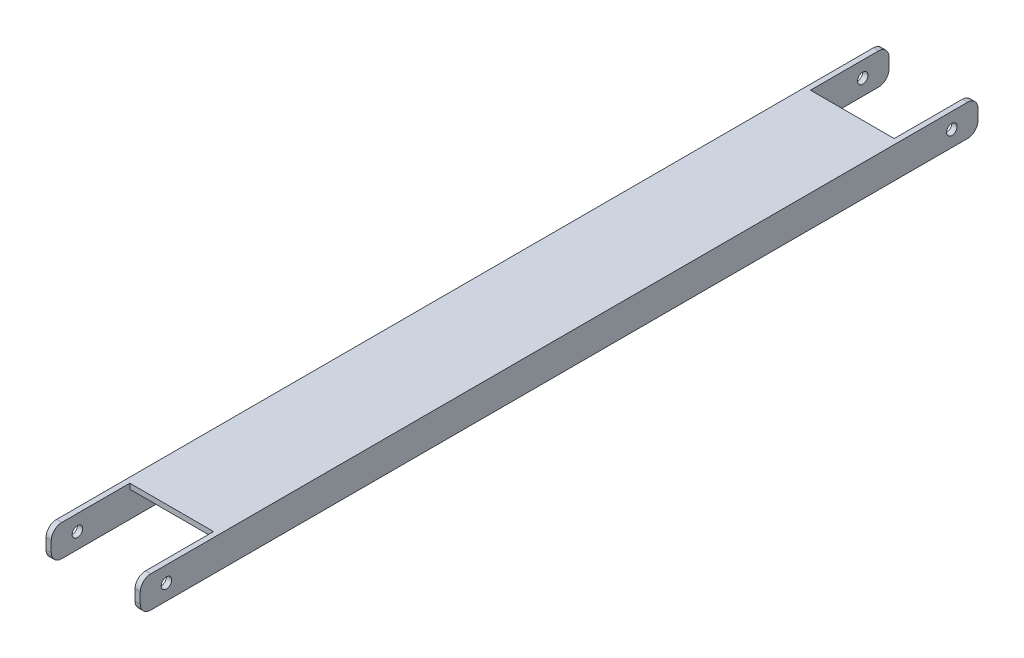
ISO-10303-21;
HEADER;
FILE_DESCRIPTION(('STEP AP214'),'2;1');
FILE_NAME('part.step','',(''),(''),'','','');
FILE_SCHEMA(('AUTOMOTIVE_DESIGN { 1 0 10303 214 1 1 1 1 }'));
ENDSEC;
DATA;
#1=APPLICATION_CONTEXT('core data for automotive mechanical design processes');
#2=APPLICATION_PROTOCOL_DEFINITION('international standard','automotive_design',2000,#1);
#3=PRODUCT_CONTEXT('',#1,'mechanical');
#4=PRODUCT('Part','Part','',(#3));
#5=PRODUCT_RELATED_PRODUCT_CATEGORY('part','',(#4));
#6=PRODUCT_DEFINITION_FORMATION('','',#4);
#7=PRODUCT_DEFINITION_CONTEXT('part definition',#1,'design');
#8=PRODUCT_DEFINITION('design','',#6,#7);
#9=PRODUCT_DEFINITION_SHAPE('','',#8);
#10=(LENGTH_UNIT() NAMED_UNIT(*) SI_UNIT(.MILLI.,.METRE.));
#11=(NAMED_UNIT(*) PLANE_ANGLE_UNIT() SI_UNIT($,.RADIAN.));
#12=(NAMED_UNIT(*) SI_UNIT($,.STERADIAN.) SOLID_ANGLE_UNIT());
#13=UNCERTAINTY_MEASURE_WITH_UNIT(LENGTH_MEASURE(1.E-05),#10,'distance_accuracy_value','');
#14=(GEOMETRIC_REPRESENTATION_CONTEXT(3) GLOBAL_UNCERTAINTY_ASSIGNED_CONTEXT((#13)) GLOBAL_UNIT_ASSIGNED_CONTEXT((#10,
#11,#12)) REPRESENTATION_CONTEXT('',''));
#15=CARTESIAN_POINT('',(0.,0.,0.));
#16=DIRECTION('',(0.,0.,1.));
#17=DIRECTION('',(1.,0.,0.));
#18=AXIS2_PLACEMENT_3D('',#15,#16,#17);
#19=CARTESIAN_POINT('',(0.,0.,160.));
#20=DIRECTION('',(0.,0.,1.));
#21=DIRECTION('',(1.,0.,0.));
#22=AXIS2_PLACEMENT_3D('',#19,#20,#21);
#23=PLANE('',#22);
#24=DIRECTION('',(0.,-1.,0.));
#25=VECTOR('',#24,1.);
#26=CARTESIAN_POINT('',(-9.,-3.,160.));
#27=LINE('',#26,#25);
#28=CARTESIAN_POINT('',(-9.,1.,160.));
#29=VERTEX_POINT('',#28);
#30=CARTESIAN_POINT('',(-9.,-1.,160.));
#31=VERTEX_POINT('',#30);
#32=EDGE_CURVE('E223',#29,#31,#27,.T.);
#33=ORIENTED_EDGE('',*,*,#32,.T.);
#34=DIRECTION('',(1.,0.,0.));
#35=VECTOR('',#34,1.);
#36=CARTESIAN_POINT('',(-8.,-1.,160.));
#37=LINE('',#36,#35);
#38=CARTESIAN_POINT('',(-8.,-1.,160.));
#39=VERTEX_POINT('',#38);
#40=EDGE_CURVE('E326',#31,#39,#37,.T.);
#41=ORIENTED_EDGE('',*,*,#40,.T.);
#42=DIRECTION('',(0.,1.,0.));
#43=VECTOR('',#42,1.);
#44=CARTESIAN_POINT('',(-8.,-3.,160.));
#45=LINE('',#44,#43);
#46=CARTESIAN_POINT('',(-8.,1.,160.));
#47=VERTEX_POINT('',#46);
#48=EDGE_CURVE('E227',#39,#47,#45,.T.);
#49=ORIENTED_EDGE('',*,*,#48,.T.);
#50=DIRECTION('',(-1.,0.,0.));
#51=VECTOR('',#50,1.);
#52=CARTESIAN_POINT('',(-9.,1.,160.));
#53=LINE('',#52,#51);
#54=EDGE_CURVE('E323',#47,#29,#53,.T.);
#55=ORIENTED_EDGE('',*,*,#54,.T.);
#56=EDGE_LOOP('',(#33,#41,#49,#55));
#57=FACE_BOUND('',#56,.T.);
#58=ADVANCED_FACE('F40',(#57),#23,.T.);
#59=CARTESIAN_POINT('',(0.,0.,0.));
#60=DIRECTION('',(0.,0.,1.));
#61=DIRECTION('',(1.,0.,0.));
#62=AXIS2_PLACEMENT_3D('',#59,#60,#61);
#63=PLANE('',#62);
#64=DIRECTION('',(0.,-1.,0.));
#65=VECTOR('',#64,1.);
#66=CARTESIAN_POINT('',(-9.,-3.,0.));
#67=LINE('',#66,#65);
#68=CARTESIAN_POINT('',(-9.,1.,0.));
#69=VERTEX_POINT('',#68);
#70=CARTESIAN_POINT('',(-9.,-1.,0.));
#71=VERTEX_POINT('',#70);
#72=EDGE_CURVE('E221',#69,#71,#67,.T.);
#73=ORIENTED_EDGE('',*,*,#72,.F.);
#74=DIRECTION('',(-1.,0.,0.));
#75=VECTOR('',#74,1.);
#76=CARTESIAN_POINT('',(0.,1.,0.));
#77=LINE('',#76,#75);
#78=CARTESIAN_POINT('',(-8.,1.,0.));
#79=VERTEX_POINT('',#78);
#80=EDGE_CURVE('E313',#69,#79,#77,.F.);
#81=ORIENTED_EDGE('',*,*,#80,.T.);
#82=DIRECTION('',(0.,1.,0.));
#83=VECTOR('',#82,1.);
#84=CARTESIAN_POINT('',(-8.,-3.,0.));
#85=LINE('',#84,#83);
#86=CARTESIAN_POINT('',(-8.,-1.,0.));
#87=VERTEX_POINT('',#86);
#88=EDGE_CURVE('E243',#87,#79,#85,.T.);
#89=ORIENTED_EDGE('',*,*,#88,.F.);
#90=DIRECTION('',(1.,0.,0.));
#91=VECTOR('',#90,1.);
#92=CARTESIAN_POINT('',(0.,-1.,0.));
#93=LINE('',#92,#91);
#94=EDGE_CURVE('E310',#87,#71,#93,.F.);
#95=ORIENTED_EDGE('',*,*,#94,.T.);
#96=EDGE_LOOP('',(#73,#81,#89,#95));
#97=FACE_BOUND('',#96,.T.);
#98=ADVANCED_FACE('F372',(#97),#63,.F.);
#99=CARTESIAN_POINT('',(-9.,-3.,160.));
#100=DIRECTION('',(1.,0.,0.));
#101=DIRECTION('',(0.,0.,-1.));
#102=AXIS2_PLACEMENT_3D('',#99,#100,#101);
#103=PLANE('',#102);
#104=CARTESIAN_POINT('',(-9.,0.,155.));
#105=DIRECTION('',(1.,0.,0.));
#106=DIRECTION('',(0.,0.,-1.));
#107=AXIS2_PLACEMENT_3D('',#104,#105,#106);
#108=CIRCLE('',#107,0.999999999999998);
#109=CARTESIAN_POINT('',(-9.,0.,154.));
#110=VERTEX_POINT('',#109);
#111=EDGE_CURVE('E566',#110,#110,#108,.T.);
#112=ORIENTED_EDGE('',*,*,#111,.T.);
#113=EDGE_LOOP('',(#112));
#114=FACE_BOUND('',#113,.T.);
#115=CARTESIAN_POINT('',(-9.,0.,5.));
#116=DIRECTION('',(1.,0.,0.));
#117=DIRECTION('',(0.,0.,-1.));
#118=AXIS2_PLACEMENT_3D('',#115,#116,#117);
#119=CIRCLE('',#118,1.);
#120=CARTESIAN_POINT('',(-9.,0.,4.));
#121=VERTEX_POINT('',#120);
#122=EDGE_CURVE('E574',#121,#121,#119,.T.);
#123=ORIENTED_EDGE('',*,*,#122,.T.);
#124=EDGE_LOOP('',(#123));
#125=FACE_BOUND('',#124,.T.);
#126=DIRECTION('',(0.,0.,-1.));
#127=VECTOR('',#126,1.);
#128=CARTESIAN_POINT('',(-9.,3.,160.));
#129=LINE('',#128,#127);
#130=CARTESIAN_POINT('',(-9.,3.,158.));
#131=VERTEX_POINT('',#130);
#132=CARTESIAN_POINT('',(-9.,3.,2.));
#133=VERTEX_POINT('',#132);
#134=EDGE_CURVE('E236',#131,#133,#129,.T.);
#135=ORIENTED_EDGE('',*,*,#134,.T.);
#136=CARTESIAN_POINT('',(-9.,1.,2.));
#137=DIRECTION('',(1.,0.,0.));
#138=DIRECTION('',(0.,0.,-1.));
#139=AXIS2_PLACEMENT_3D('',#136,#137,#138);
#140=CIRCLE('',#139,2.);
#141=EDGE_CURVE('E307',#133,#69,#140,.F.);
#142=ORIENTED_EDGE('',*,*,#141,.T.);
#143=ORIENTED_EDGE('',*,*,#72,.T.);
#144=CARTESIAN_POINT('',(-9.,-1.,2.));
#145=DIRECTION('',(1.,0.,0.));
#146=DIRECTION('',(0.,0.,-1.));
#147=AXIS2_PLACEMENT_3D('',#144,#145,#146);
#148=CIRCLE('',#147,2.);
#149=CARTESIAN_POINT('',(-9.,-3.,2.));
#150=VERTEX_POINT('',#149);
#151=EDGE_CURVE('E303',#71,#150,#148,.F.);
#152=ORIENTED_EDGE('',*,*,#151,.T.);
#153=DIRECTION('',(0.,0.,-1.));
#154=VECTOR('',#153,1.);
#155=CARTESIAN_POINT('',(-9.,-3.,160.));
#156=LINE('',#155,#154);
#157=CARTESIAN_POINT('',(-9.,-3.,158.));
#158=VERTEX_POINT('',#157);
#159=EDGE_CURVE('E262',#158,#150,#156,.T.);
#160=ORIENTED_EDGE('',*,*,#159,.F.);
#161=CARTESIAN_POINT('',(-9.,-1.,158.));
#162=DIRECTION('',(1.,0.,0.));
#163=DIRECTION('',(0.,0.,-1.));
#164=AXIS2_PLACEMENT_3D('',#161,#162,#163);
#165=CIRCLE('',#164,2.);
#166=EDGE_CURVE('E305',#158,#31,#165,.F.);
#167=ORIENTED_EDGE('',*,*,#166,.T.);
#168=ORIENTED_EDGE('',*,*,#32,.F.);
#169=CARTESIAN_POINT('',(-9.,1.,158.));
#170=DIRECTION('',(1.,0.,0.));
#171=DIRECTION('',(0.,0.,-1.));
#172=AXIS2_PLACEMENT_3D('',#169,#170,#171);
#173=CIRCLE('',#172,2.);
#174=EDGE_CURVE('E302',#29,#131,#173,.F.);
#175=ORIENTED_EDGE('',*,*,#174,.T.);
#176=EDGE_LOOP('',(#135,#142,#143,#152,#160,#167,#168,#175));
#177=FACE_BOUND('',#176,.T.);
#178=ADVANCED_FACE('F381',(#114,#125,#177),#103,.F.);
#179=CARTESIAN_POINT('',(-9.,-3.,160.));
#180=DIRECTION('',(0.,1.,0.));
#181=DIRECTION('',(0.,0.,1.));
#182=AXIS2_PLACEMENT_3D('',#179,#180,#181);
#183=PLANE('',#182);
#184=ORIENTED_EDGE('',*,*,#159,.T.);
#185=DIRECTION('',(1.,0.,0.));
#186=VECTOR('',#185,1.);
#187=CARTESIAN_POINT('',(-9.,-3.,2.));
#188=LINE('',#187,#186);
#189=CARTESIAN_POINT('',(-8.,-3.,2.));
#190=VERTEX_POINT('',#189);
#191=EDGE_CURVE('E321',#150,#190,#188,.T.);
#192=ORIENTED_EDGE('',*,*,#191,.T.);
#193=DIRECTION('',(0.,0.,-1.));
#194=VECTOR('',#193,1.);
#195=CARTESIAN_POINT('',(-8.,-3.,160.));
#196=LINE('',#195,#194);
#197=CARTESIAN_POINT('',(-8.,-3.,158.));
#198=VERTEX_POINT('',#197);
#199=EDGE_CURVE('E265',#198,#190,#196,.T.);
#200=ORIENTED_EDGE('',*,*,#199,.F.);
#201=DIRECTION('',(1.,0.,0.));
#202=VECTOR('',#201,1.);
#203=CARTESIAN_POINT('',(-9.,-3.,158.));
#204=LINE('',#203,#202);
#205=EDGE_CURVE('E317',#198,#158,#204,.F.);
#206=ORIENTED_EDGE('',*,*,#205,.T.);
#207=EDGE_LOOP('',(#184,#192,#200,#206));
#208=FACE_BOUND('',#207,.T.);
#209=ADVANCED_FACE('F426',(#208),#183,.F.);
#210=CARTESIAN_POINT('',(-8.,-3.,160.));
#211=DIRECTION('',(-1.,0.,0.));
#212=DIRECTION('',(0.,0.,1.));
#213=AXIS2_PLACEMENT_3D('',#210,#211,#212);
#214=PLANE('',#213);
#215=CARTESIAN_POINT('',(-8.,0.,155.));
#216=DIRECTION('',(-1.,0.,0.));
#217=DIRECTION('',(0.,0.,1.));
#218=AXIS2_PLACEMENT_3D('',#215,#216,#217);
#219=CIRCLE('',#218,0.999999999999998);
#220=CARTESIAN_POINT('',(-8.,0.,156.));
#221=VERTEX_POINT('',#220);
#222=EDGE_CURVE('E187',#221,#221,#219,.T.);
#223=ORIENTED_EDGE('',*,*,#222,.T.);
#224=EDGE_LOOP('',(#223));
#225=FACE_BOUND('',#224,.T.);
#226=CARTESIAN_POINT('',(-8.,0.,5.));
#227=DIRECTION('',(-1.,0.,0.));
#228=DIRECTION('',(0.,0.,1.));
#229=AXIS2_PLACEMENT_3D('',#226,#227,#228);
#230=CIRCLE('',#229,1.);
#231=CARTESIAN_POINT('',(-8.,0.,6.));
#232=VERTEX_POINT('',#231);
#233=EDGE_CURVE('E560',#232,#232,#230,.T.);
#234=ORIENTED_EDGE('',*,*,#233,.T.);
#235=EDGE_LOOP('',(#234));
#236=FACE_BOUND('',#235,.T.);
#237=ORIENTED_EDGE('',*,*,#88,.T.);
#238=CARTESIAN_POINT('',(-8.,1.,2.));
#239=DIRECTION('',(-1.,0.,0.));
#240=DIRECTION('',(0.,0.,1.));
#241=AXIS2_PLACEMENT_3D('',#238,#239,#240);
#242=CIRCLE('',#241,2.);
#243=CARTESIAN_POINT('',(-8.,3.,2.));
#244=VERTEX_POINT('',#243);
#245=EDGE_CURVE('E320',#79,#244,#242,.F.);
#246=ORIENTED_EDGE('',*,*,#245,.T.);
#247=DIRECTION('',(0.,0.,1.));
#248=VECTOR('',#247,1.);
#249=CARTESIAN_POINT('',(-8.,3.,0.));
#250=LINE('',#249,#248);
#251=CARTESIAN_POINT('',(-8.,3.,15.));
#252=VERTEX_POINT('',#251);
#253=EDGE_CURVE('E208',#244,#252,#250,.T.);
#254=ORIENTED_EDGE('',*,*,#253,.T.);
#255=DIRECTION('',(0.,1.,0.));
#256=VECTOR('',#255,1.);
#257=CARTESIAN_POINT('',(-7.99999999999999,-3.,15.));
#258=LINE('',#257,#256);
#259=CARTESIAN_POINT('',(-7.99999999999999,2.,15.));
#260=VERTEX_POINT('',#259);
#261=EDGE_CURVE('E216',#260,#252,#258,.T.);
#262=ORIENTED_EDGE('',*,*,#261,.F.);
#263=DIRECTION('',(0.,0.,-1.));
#264=VECTOR('',#263,1.);
#265=CARTESIAN_POINT('',(-8.,2.,160.));
#266=LINE('',#265,#264);
#267=CARTESIAN_POINT('',(-7.99999999999999,2.,145.));
#268=VERTEX_POINT('',#267);
#269=EDGE_CURVE('E257',#268,#260,#266,.T.);
#270=ORIENTED_EDGE('',*,*,#269,.F.);
#271=DIRECTION('',(0.,1.,0.));
#272=VECTOR('',#271,1.);
#273=CARTESIAN_POINT('',(-7.99999999999999,-3.,145.));
#274=LINE('',#273,#272);
#275=CARTESIAN_POINT('',(-8.,3.,145.));
#276=VERTEX_POINT('',#275);
#277=EDGE_CURVE('E198',#268,#276,#274,.T.);
#278=ORIENTED_EDGE('',*,*,#277,.T.);
#279=DIRECTION('',(0.,0.,1.));
#280=VECTOR('',#279,1.);
#281=CARTESIAN_POINT('',(-8.,3.,160.));
#282=LINE('',#281,#280);
#283=CARTESIAN_POINT('',(-8.,3.,158.));
#284=VERTEX_POINT('',#283);
#285=EDGE_CURVE('E197',#276,#284,#282,.T.);
#286=ORIENTED_EDGE('',*,*,#285,.T.);
#287=CARTESIAN_POINT('',(-8.,1.,158.));
#288=DIRECTION('',(-1.,0.,0.));
#289=DIRECTION('',(0.,0.,1.));
#290=AXIS2_PLACEMENT_3D('',#287,#288,#289);
#291=CIRCLE('',#290,2.);
#292=EDGE_CURVE('E311',#284,#47,#291,.F.);
#293=ORIENTED_EDGE('',*,*,#292,.T.);
#294=ORIENTED_EDGE('',*,*,#48,.F.);
#295=CARTESIAN_POINT('',(-8.,-1.,158.));
#296=DIRECTION('',(-1.,0.,0.));
#297=DIRECTION('',(0.,0.,1.));
#298=AXIS2_PLACEMENT_3D('',#295,#296,#297);
#299=CIRCLE('',#298,2.);
#300=EDGE_CURVE('E58',#39,#198,#299,.F.);
#301=ORIENTED_EDGE('',*,*,#300,.T.);
#302=ORIENTED_EDGE('',*,*,#199,.T.);
#303=CARTESIAN_POINT('',(-8.,-1.,2.));
#304=DIRECTION('',(-1.,0.,0.));
#305=DIRECTION('',(0.,0.,1.));
#306=AXIS2_PLACEMENT_3D('',#303,#304,#305);
#307=CIRCLE('',#306,2.);
#308=EDGE_CURVE('E55',#190,#87,#307,.F.);
#309=ORIENTED_EDGE('',*,*,#308,.T.);
#310=EDGE_LOOP('',(#237,#246,#254,#262,#270,#278,#286,#293,#294,#301,#302,#309));
#311=FACE_BOUND('',#310,.T.);
#312=ADVANCED_FACE('F418',(#225,#236,#311),#214,.F.);
#313=CARTESIAN_POINT('',(8.,2.,160.));
#314=DIRECTION('',(0.,1.,0.));
#315=DIRECTION('',(0.,0.,1.));
#316=AXIS2_PLACEMENT_3D('',#313,#314,#315);
#317=PLANE('',#316);
#318=DIRECTION('',(0.,0.,-1.));
#319=VECTOR('',#318,1.);
#320=CARTESIAN_POINT('',(8.,2.,160.));
#321=LINE('',#320,#319);
#322=CARTESIAN_POINT('',(8.,2.,145.));
#323=VERTEX_POINT('',#322);
#324=CARTESIAN_POINT('',(8.,2.,15.));
#325=VERTEX_POINT('',#324);
#326=EDGE_CURVE('E256',#323,#325,#321,.T.);
#327=ORIENTED_EDGE('',*,*,#326,.F.);
#328=DIRECTION('',(-1.,0.,0.));
#329=VECTOR('',#328,1.);
#330=CARTESIAN_POINT('',(8.,2.,145.));
#331=LINE('',#330,#329);
#332=EDGE_CURVE('E193',#323,#268,#331,.T.);
#333=ORIENTED_EDGE('',*,*,#332,.T.);
#334=ORIENTED_EDGE('',*,*,#269,.T.);
#335=DIRECTION('',(1.,0.,0.));
#336=VECTOR('',#335,1.);
#337=CARTESIAN_POINT('',(8.,2.,15.));
#338=LINE('',#337,#336);
#339=EDGE_CURVE('E218',#260,#325,#338,.T.);
#340=ORIENTED_EDGE('',*,*,#339,.T.);
#341=EDGE_LOOP('',(#327,#333,#334,#340));
#342=FACE_BOUND('',#341,.T.);
#343=ADVANCED_FACE('F367',(#342),#317,.F.);
#344=CARTESIAN_POINT('',(8.,-3.,160.));
#345=DIRECTION('',(1.,0.,0.));
#346=DIRECTION('',(0.,0.,-1.));
#347=AXIS2_PLACEMENT_3D('',#344,#345,#346);
#348=PLANE('',#347);
#349=CARTESIAN_POINT('',(8.,0.,155.));
#350=DIRECTION('',(1.,0.,0.));
#351=DIRECTION('',(0.,0.,-1.));
#352=AXIS2_PLACEMENT_3D('',#349,#350,#351);
#353=CIRCLE('',#352,0.999999999999998);
#354=CARTESIAN_POINT('',(8.,0.,154.));
#355=VERTEX_POINT('',#354);
#356=EDGE_CURVE('E557',#355,#355,#353,.T.);
#357=ORIENTED_EDGE('',*,*,#356,.T.);
#358=EDGE_LOOP('',(#357));
#359=FACE_BOUND('',#358,.T.);
#360=CARTESIAN_POINT('',(8.,0.,5.));
#361=DIRECTION('',(1.,0.,0.));
#362=DIRECTION('',(0.,0.,-1.));
#363=AXIS2_PLACEMENT_3D('',#360,#361,#362);
#364=CIRCLE('',#363,1.);
#365=CARTESIAN_POINT('',(8.,0.,4.));
#366=VERTEX_POINT('',#365);
#367=EDGE_CURVE('E565',#366,#366,#364,.T.);
#368=ORIENTED_EDGE('',*,*,#367,.T.);
#369=EDGE_LOOP('',(#368));
#370=FACE_BOUND('',#369,.T.);
#371=DIRECTION('',(0.,-1.,0.));
#372=VECTOR('',#371,1.);
#373=CARTESIAN_POINT('',(8.,-3.,0.));
#374=LINE('',#373,#372);
#375=CARTESIAN_POINT('',(8.,1.,0.));
#376=VERTEX_POINT('',#375);
#377=CARTESIAN_POINT('',(8.,-0.999999999999998,0.));
#378=VERTEX_POINT('',#377);
#379=EDGE_CURVE('E245',#376,#378,#374,.T.);
#380=ORIENTED_EDGE('',*,*,#379,.T.);
#381=CARTESIAN_POINT('',(8.,-0.999999999999998,2.));
#382=DIRECTION('',(1.,0.,0.));
#383=DIRECTION('',(0.,0.,-1.));
#384=AXIS2_PLACEMENT_3D('',#381,#382,#383);
#385=CIRCLE('',#384,2.);
#386=CARTESIAN_POINT('',(8.,-3.,2.));
#387=VERTEX_POINT('',#386);
#388=EDGE_CURVE('E286',#378,#387,#385,.F.);
#389=ORIENTED_EDGE('',*,*,#388,.T.);
#390=DIRECTION('',(0.,0.,-1.));
#391=VECTOR('',#390,1.);
#392=CARTESIAN_POINT('',(8.,-3.,160.));
#393=LINE('',#392,#391);
#394=CARTESIAN_POINT('',(8.,-3.,158.));
#395=VERTEX_POINT('',#394);
#396=EDGE_CURVE('E254',#395,#387,#393,.T.);
#397=ORIENTED_EDGE('',*,*,#396,.F.);
#398=CARTESIAN_POINT('',(8.,-0.999999999999998,158.));
#399=DIRECTION('',(1.,0.,0.));
#400=DIRECTION('',(0.,0.,-1.));
#401=AXIS2_PLACEMENT_3D('',#398,#399,#400);
#402=CIRCLE('',#401,2.);
#403=CARTESIAN_POINT('',(8.,-0.999999999999998,160.));
#404=VERTEX_POINT('',#403);
#405=EDGE_CURVE('E281',#395,#404,#402,.F.);
#406=ORIENTED_EDGE('',*,*,#405,.T.);
#407=DIRECTION('',(0.,-1.,0.));
#408=VECTOR('',#407,1.);
#409=CARTESIAN_POINT('',(8.,-3.,160.));
#410=LINE('',#409,#408);
#411=CARTESIAN_POINT('',(8.,1.,160.));
#412=VERTEX_POINT('',#411);
#413=EDGE_CURVE('E234',#412,#404,#410,.T.);
#414=ORIENTED_EDGE('',*,*,#413,.F.);
#415=CARTESIAN_POINT('',(8.,1.,158.));
#416=DIRECTION('',(1.,0.,0.));
#417=DIRECTION('',(0.,0.,-1.));
#418=AXIS2_PLACEMENT_3D('',#415,#416,#417);
#419=CIRCLE('',#418,2.);
#420=CARTESIAN_POINT('',(8.,3.,158.));
#421=VERTEX_POINT('',#420);
#422=EDGE_CURVE('E181',#412,#421,#419,.F.);
#423=ORIENTED_EDGE('',*,*,#422,.T.);
#424=DIRECTION('',(0.,0.,-1.));
#425=VECTOR('',#424,1.);
#426=CARTESIAN_POINT('',(8.,3.,145.));
#427=LINE('',#426,#425);
#428=CARTESIAN_POINT('',(8.,3.,145.));
#429=VERTEX_POINT('',#428);
#430=EDGE_CURVE('E177',#421,#429,#427,.T.);
#431=ORIENTED_EDGE('',*,*,#430,.T.);
#432=DIRECTION('',(0.,1.,0.));
#433=VECTOR('',#432,1.);
#434=CARTESIAN_POINT('',(8.,-3.,145.));
#435=LINE('',#434,#433);
#436=EDGE_CURVE('E178',#323,#429,#435,.T.);
#437=ORIENTED_EDGE('',*,*,#436,.F.);
#438=ORIENTED_EDGE('',*,*,#326,.T.);
#439=DIRECTION('',(0.,1.,0.));
#440=VECTOR('',#439,1.);
#441=CARTESIAN_POINT('',(8.,-3.,15.));
#442=LINE('',#441,#440);
#443=CARTESIAN_POINT('',(8.,3.,15.));
#444=VERTEX_POINT('',#443);
#445=EDGE_CURVE('E220',#325,#444,#442,.T.);
#446=ORIENTED_EDGE('',*,*,#445,.T.);
#447=DIRECTION('',(0.,0.,-1.));
#448=VECTOR('',#447,1.);
#449=CARTESIAN_POINT('',(8.,3.,15.));
#450=LINE('',#449,#448);
#451=CARTESIAN_POINT('',(8.,3.,2.00000000000001));
#452=VERTEX_POINT('',#451);
#453=EDGE_CURVE('E213',#444,#452,#450,.T.);
#454=ORIENTED_EDGE('',*,*,#453,.T.);
#455=CARTESIAN_POINT('',(8.,1.,2.));
#456=DIRECTION('',(1.,0.,0.));
#457=DIRECTION('',(0.,0.,-1.));
#458=AXIS2_PLACEMENT_3D('',#455,#456,#457);
#459=CIRCLE('',#458,2.);
#460=EDGE_CURVE('E289',#452,#376,#459,.F.);
#461=ORIENTED_EDGE('',*,*,#460,.T.);
#462=EDGE_LOOP('',(#380,#389,#397,#406,#414,#423,#431,#437,#438,#446,#454,#461));
#463=FACE_BOUND('',#462,.T.);
#464=ADVANCED_FACE('F176',(#359,#370,#463),#348,.F.);
#465=CARTESIAN_POINT('',(8.,-3.,160.));
#466=DIRECTION('',(0.,1.,0.));
#467=DIRECTION('',(0.,0.,1.));
#468=AXIS2_PLACEMENT_3D('',#465,#466,#467);
#469=PLANE('',#468);
#470=ORIENTED_EDGE('',*,*,#396,.T.);
#471=DIRECTION('',(1.,0.,0.));
#472=VECTOR('',#471,1.);
#473=CARTESIAN_POINT('',(8.,-3.,2.));
#474=LINE('',#473,#472);
#475=CARTESIAN_POINT('',(9.,-3.,2.));
#476=VERTEX_POINT('',#475);
#477=EDGE_CURVE('E267',#387,#476,#474,.T.);
#478=ORIENTED_EDGE('',*,*,#477,.T.);
#479=DIRECTION('',(0.,0.,-1.));
#480=VECTOR('',#479,1.);
#481=CARTESIAN_POINT('',(9.,-3.,160.));
#482=LINE('',#481,#480);
#483=CARTESIAN_POINT('',(9.,-3.,158.));
#484=VERTEX_POINT('',#483);
#485=EDGE_CURVE('E252',#484,#476,#482,.T.);
#486=ORIENTED_EDGE('',*,*,#485,.F.);
#487=DIRECTION('',(1.,0.,0.));
#488=VECTOR('',#487,1.);
#489=CARTESIAN_POINT('',(8.,-3.,158.));
#490=LINE('',#489,#488);
#491=EDGE_CURVE('E270',#484,#395,#490,.F.);
#492=ORIENTED_EDGE('',*,*,#491,.T.);
#493=EDGE_LOOP('',(#470,#478,#486,#492));
#494=FACE_BOUND('',#493,.T.);
#495=ADVANCED_FACE('F363',(#494),#469,.F.);
#496=CARTESIAN_POINT('',(9.,-3.,160.));
#497=DIRECTION('',(-1.,0.,0.));
#498=DIRECTION('',(0.,0.,1.));
#499=AXIS2_PLACEMENT_3D('',#496,#497,#498);
#500=PLANE('',#499);
#501=CARTESIAN_POINT('',(9.,0.,155.));
#502=DIRECTION('',(1.,0.,0.));
#503=DIRECTION('',(0.,0.,-1.));
#504=AXIS2_PLACEMENT_3D('',#501,#502,#503);
#505=CIRCLE('',#504,0.999999999999998);
#506=CARTESIAN_POINT('',(9.,0.,154.));
#507=VERTEX_POINT('',#506);
#508=EDGE_CURVE('E553',#507,#507,#505,.T.);
#509=ORIENTED_EDGE('',*,*,#508,.F.);
#510=EDGE_LOOP('',(#509));
#511=FACE_BOUND('',#510,.T.);
#512=CARTESIAN_POINT('',(9.,0.,5.));
#513=DIRECTION('',(1.,0.,0.));
#514=DIRECTION('',(0.,0.,-1.));
#515=AXIS2_PLACEMENT_3D('',#512,#513,#514);
#516=CIRCLE('',#515,1.);
#517=CARTESIAN_POINT('',(9.,0.,4.));
#518=VERTEX_POINT('',#517);
#519=EDGE_CURVE('E569',#518,#518,#516,.T.);
#520=ORIENTED_EDGE('',*,*,#519,.F.);
#521=EDGE_LOOP('',(#520));
#522=FACE_BOUND('',#521,.T.);
#523=ORIENTED_EDGE('',*,*,#485,.T.);
#524=CARTESIAN_POINT('',(9.,-0.999999999999998,2.));
#525=DIRECTION('',(-1.,0.,0.));
#526=DIRECTION('',(0.,0.,1.));
#527=AXIS2_PLACEMENT_3D('',#524,#525,#526);
#528=CIRCLE('',#527,2.);
#529=CARTESIAN_POINT('',(9.,-0.999999999999998,0.));
#530=VERTEX_POINT('',#529);
#531=EDGE_CURVE('E279',#476,#530,#528,.F.);
#532=ORIENTED_EDGE('',*,*,#531,.T.);
#533=DIRECTION('',(0.,1.,0.));
#534=VECTOR('',#533,1.);
#535=CARTESIAN_POINT('',(9.,-3.,0.));
#536=LINE('',#535,#534);
#537=CARTESIAN_POINT('',(9.,1.,0.));
#538=VERTEX_POINT('',#537);
#539=EDGE_CURVE('E230',#530,#538,#536,.T.);
#540=ORIENTED_EDGE('',*,*,#539,.T.);
#541=CARTESIAN_POINT('',(9.,1.,2.));
#542=DIRECTION('',(-1.,0.,0.));
#543=DIRECTION('',(0.,0.,1.));
#544=AXIS2_PLACEMENT_3D('',#541,#542,#543);
#545=CIRCLE('',#544,2.);
#546=CARTESIAN_POINT('',(9.,3.,2.));
#547=VERTEX_POINT('',#546);
#548=EDGE_CURVE('E277',#538,#547,#545,.F.);
#549=ORIENTED_EDGE('',*,*,#548,.T.);
#550=DIRECTION('',(0.,0.,-1.));
#551=VECTOR('',#550,1.);
#552=CARTESIAN_POINT('',(9.,3.,160.));
#553=LINE('',#552,#551);
#554=CARTESIAN_POINT('',(9.,3.,158.));
#555=VERTEX_POINT('',#554);
#556=EDGE_CURVE('E248',#555,#547,#553,.T.);
#557=ORIENTED_EDGE('',*,*,#556,.F.);
#558=CARTESIAN_POINT('',(9.,1.,158.));
#559=DIRECTION('',(-1.,0.,0.));
#560=DIRECTION('',(0.,0.,1.));
#561=AXIS2_PLACEMENT_3D('',#558,#559,#560);
#562=CIRCLE('',#561,2.);
#563=CARTESIAN_POINT('',(9.,1.,160.));
#564=VERTEX_POINT('',#563);
#565=EDGE_CURVE('E275',#555,#564,#562,.F.);
#566=ORIENTED_EDGE('',*,*,#565,.T.);
#567=DIRECTION('',(0.,1.,0.));
#568=VECTOR('',#567,1.);
#569=CARTESIAN_POINT('',(9.,-3.,160.));
#570=LINE('',#569,#568);
#571=CARTESIAN_POINT('',(9.,-0.999999999999998,160.));
#572=VERTEX_POINT('',#571);
#573=EDGE_CURVE('E233',#572,#564,#570,.T.);
#574=ORIENTED_EDGE('',*,*,#573,.F.);
#575=CARTESIAN_POINT('',(9.,-0.999999999999998,158.));
#576=DIRECTION('',(-1.,0.,0.));
#577=DIRECTION('',(0.,0.,1.));
#578=AXIS2_PLACEMENT_3D('',#575,#576,#577);
#579=CIRCLE('',#578,2.);
#580=EDGE_CURVE('E273',#572,#484,#579,.F.);
#581=ORIENTED_EDGE('',*,*,#580,.T.);
#582=EDGE_LOOP('',(#523,#532,#540,#549,#557,#566,#574,#581));
#583=FACE_BOUND('',#582,.T.);
#584=ADVANCED_FACE('F344',(#511,#522,#583),#500,.F.);
#585=CARTESIAN_POINT('',(9.,3.,160.));
#586=DIRECTION('',(0.,-1.,0.));
#587=DIRECTION('',(1.,0.,0.));
#588=AXIS2_PLACEMENT_3D('',#585,#586,#587);
#589=PLANE('',#588);
#590=ORIENTED_EDGE('',*,*,#556,.T.);
#591=DIRECTION('',(-1.,0.,0.));
#592=VECTOR('',#591,1.);
#593=CARTESIAN_POINT('',(9.,3.,2.));
#594=LINE('',#593,#592);
#595=EDGE_CURVE('E297',#547,#452,#594,.T.);
#596=ORIENTED_EDGE('',*,*,#595,.T.);
#597=ORIENTED_EDGE('',*,*,#453,.F.);
#598=DIRECTION('',(1.,0.,0.));
#599=VECTOR('',#598,1.);
#600=CARTESIAN_POINT('',(-8.,3.,15.));
#601=LINE('',#600,#599);
#602=EDGE_CURVE('E209',#252,#444,#601,.T.);
#603=ORIENTED_EDGE('',*,*,#602,.F.);
#604=ORIENTED_EDGE('',*,*,#253,.F.);
#605=DIRECTION('',(-1.,0.,0.));
#606=VECTOR('',#605,1.);
#607=CARTESIAN_POINT('',(9.,3.,2.));
#608=LINE('',#607,#606);
#609=EDGE_CURVE('E293',#244,#133,#608,.T.);
#610=ORIENTED_EDGE('',*,*,#609,.T.);
#611=ORIENTED_EDGE('',*,*,#134,.F.);
#612=DIRECTION('',(-1.,0.,0.));
#613=VECTOR('',#612,1.);
#614=CARTESIAN_POINT('',(-8.,3.,158.));
#615=LINE('',#614,#613);
#616=EDGE_CURVE('E291',#131,#284,#615,.F.);
#617=ORIENTED_EDGE('',*,*,#616,.T.);
#618=ORIENTED_EDGE('',*,*,#285,.F.);
#619=DIRECTION('',(-1.,0.,0.));
#620=VECTOR('',#619,1.);
#621=CARTESIAN_POINT('',(-8.,3.,145.));
#622=LINE('',#621,#620);
#623=EDGE_CURVE('E189',#429,#276,#622,.T.);
#624=ORIENTED_EDGE('',*,*,#623,.F.);
#625=ORIENTED_EDGE('',*,*,#430,.F.);
#626=DIRECTION('',(-1.,0.,0.));
#627=VECTOR('',#626,1.);
#628=CARTESIAN_POINT('',(9.,3.,158.));
#629=LINE('',#628,#627);
#630=EDGE_CURVE('E292',#421,#555,#629,.F.);
#631=ORIENTED_EDGE('',*,*,#630,.T.);
#632=EDGE_LOOP('',(#590,#596,#597,#603,#604,#610,#611,#617,#618,#624,#625,#631));
#633=FACE_BOUND('',#632,.T.);
#634=ADVANCED_FACE('F199',(#633),#589,.F.);
#635=ORIENTED_EDGE('',*,*,#413,.T.);
#636=DIRECTION('',(1.,0.,0.));
#637=VECTOR('',#636,1.);
#638=CARTESIAN_POINT('',(9.,-0.999999999999998,160.));
#639=LINE('',#638,#637);
#640=EDGE_CURVE('E11',#404,#572,#639,.T.);
#641=ORIENTED_EDGE('',*,*,#640,.T.);
#642=ORIENTED_EDGE('',*,*,#573,.T.);
#643=DIRECTION('',(-1.,0.,0.));
#644=VECTOR('',#643,1.);
#645=CARTESIAN_POINT('',(8.,1.,160.));
#646=LINE('',#645,#644);
#647=EDGE_CURVE('E44',#564,#412,#646,.T.);
#648=ORIENTED_EDGE('',*,*,#647,.T.);
#649=EDGE_LOOP('',(#635,#641,#642,#648));
#650=FACE_BOUND('',#649,.T.);
#651=ADVANCED_FACE('F332',(#650),#23,.T.);
#652=ORIENTED_EDGE('',*,*,#539,.F.);
#653=DIRECTION('',(1.,0.,0.));
#654=VECTOR('',#653,1.);
#655=CARTESIAN_POINT('',(0.,-0.999999999999998,0.));
#656=LINE('',#655,#654);
#657=EDGE_CURVE('E284',#530,#378,#656,.F.);
#658=ORIENTED_EDGE('',*,*,#657,.T.);
#659=ORIENTED_EDGE('',*,*,#379,.F.);
#660=DIRECTION('',(-1.,0.,0.));
#661=VECTOR('',#660,1.);
#662=CARTESIAN_POINT('',(0.,1.,0.));
#663=LINE('',#662,#661);
#664=EDGE_CURVE('E278',#376,#538,#663,.F.);
#665=ORIENTED_EDGE('',*,*,#664,.T.);
#666=EDGE_LOOP('',(#652,#658,#659,#665));
#667=FACE_BOUND('',#666,.T.);
#668=ADVANCED_FACE('F351',(#667),#63,.F.);
#669=CARTESIAN_POINT('',(-7.99999999999999,-3.,15.));
#670=DIRECTION('',(0.,0.,1.));
#671=DIRECTION('',(1.,0.,0.));
#672=AXIS2_PLACEMENT_3D('',#669,#670,#671);
#673=PLANE('',#672);
#674=ORIENTED_EDGE('',*,*,#261,.T.);
#675=ORIENTED_EDGE('',*,*,#602,.T.);
#676=ORIENTED_EDGE('',*,*,#445,.F.);
#677=ORIENTED_EDGE('',*,*,#339,.F.);
#678=EDGE_LOOP('',(#674,#675,#676,#677));
#679=FACE_BOUND('',#678,.T.);
#680=ADVANCED_FACE('F388',(#679),#673,.F.);
#681=CARTESIAN_POINT('',(-7.99999999999999,-3.,145.));
#682=DIRECTION('',(0.,0.,-1.));
#683=DIRECTION('',(-1.,0.,0.));
#684=AXIS2_PLACEMENT_3D('',#681,#682,#683);
#685=PLANE('',#684);
#686=ORIENTED_EDGE('',*,*,#436,.T.);
#687=ORIENTED_EDGE('',*,*,#623,.T.);
#688=ORIENTED_EDGE('',*,*,#277,.F.);
#689=ORIENTED_EDGE('',*,*,#332,.F.);
#690=EDGE_LOOP('',(#686,#687,#688,#689));
#691=FACE_BOUND('',#690,.T.);
#692=ADVANCED_FACE('F194',(#691),#685,.F.);
#693=CARTESIAN_POINT('',(-9.,0.,5.));
#694=DIRECTION('',(1.,0.,0.));
#695=DIRECTION('',(0.,0.,-1.));
#696=AXIS2_PLACEMENT_3D('',#693,#694,#695);
#697=CYLINDRICAL_SURFACE('',#696,1.);
#698=ORIENTED_EDGE('',*,*,#519,.T.);
#699=EDGE_LOOP('',(#698));
#700=FACE_BOUND('',#699,.T.);
#701=ORIENTED_EDGE('',*,*,#367,.F.);
#702=EDGE_LOOP('',(#701));
#703=FACE_BOUND('',#702,.T.);
#704=ADVANCED_FACE('F534',(#700,#703),#697,.F.);
#705=CARTESIAN_POINT('',(-9.,0.,155.));
#706=DIRECTION('',(1.,0.,0.));
#707=DIRECTION('',(0.,0.,-1.));
#708=AXIS2_PLACEMENT_3D('',#705,#706,#707);
#709=CYLINDRICAL_SURFACE('',#708,0.999999999999998);
#710=ORIENTED_EDGE('',*,*,#508,.T.);
#711=EDGE_LOOP('',(#710));
#712=FACE_BOUND('',#711,.T.);
#713=ORIENTED_EDGE('',*,*,#356,.F.);
#714=EDGE_LOOP('',(#713));
#715=FACE_BOUND('',#714,.T.);
#716=ADVANCED_FACE('F539',(#712,#715),#709,.F.);
#717=ORIENTED_EDGE('',*,*,#122,.F.);
#718=EDGE_LOOP('',(#717));
#719=FACE_BOUND('',#718,.T.);
#720=ORIENTED_EDGE('',*,*,#233,.F.);
#721=EDGE_LOOP('',(#720));
#722=FACE_BOUND('',#721,.T.);
#723=ADVANCED_FACE('F540',(#719,#722),#697,.F.);
#724=ORIENTED_EDGE('',*,*,#111,.F.);
#725=EDGE_LOOP('',(#724));
#726=FACE_BOUND('',#725,.T.);
#727=ORIENTED_EDGE('',*,*,#222,.F.);
#728=EDGE_LOOP('',(#727));
#729=FACE_BOUND('',#728,.T.);
#730=ADVANCED_FACE('F459',(#726,#729),#709,.F.);
#731=CARTESIAN_POINT('',(8.,-0.999999999999998,2.));
#732=DIRECTION('',(1.,0.,0.));
#733=DIRECTION('',(0.,0.,-1.));
#734=AXIS2_PLACEMENT_3D('',#731,#732,#733);
#735=CYLINDRICAL_SURFACE('',#734,2.);
#736=ORIENTED_EDGE('',*,*,#388,.F.);
#737=ORIENTED_EDGE('',*,*,#657,.F.);
#738=ORIENTED_EDGE('',*,*,#531,.F.);
#739=ORIENTED_EDGE('',*,*,#477,.F.);
#740=EDGE_LOOP('',(#736,#737,#738,#739));
#741=FACE_BOUND('',#740,.T.);
#742=ADVANCED_FACE('F360',(#741),#735,.T.);
#743=CARTESIAN_POINT('',(9.,1.,2.));
#744=DIRECTION('',(-1.,0.,0.));
#745=DIRECTION('',(0.,-1.,0.));
#746=AXIS2_PLACEMENT_3D('',#743,#744,#745);
#747=CYLINDRICAL_SURFACE('',#746,2.);
#748=ORIENTED_EDGE('',*,*,#548,.F.);
#749=ORIENTED_EDGE('',*,*,#664,.F.);
#750=ORIENTED_EDGE('',*,*,#460,.F.);
#751=ORIENTED_EDGE('',*,*,#595,.F.);
#752=EDGE_LOOP('',(#748,#749,#750,#751));
#753=FACE_BOUND('',#752,.T.);
#754=ADVANCED_FACE('F349',(#753),#747,.T.);
#755=CARTESIAN_POINT('',(9.,1.,2.));
#756=DIRECTION('',(-1.,0.,0.));
#757=DIRECTION('',(0.,-1.,0.));
#758=AXIS2_PLACEMENT_3D('',#755,#756,#757);
#759=CYLINDRICAL_SURFACE('',#758,2.);
#760=ORIENTED_EDGE('',*,*,#245,.F.);
#761=ORIENTED_EDGE('',*,*,#80,.F.);
#762=ORIENTED_EDGE('',*,*,#141,.F.);
#763=ORIENTED_EDGE('',*,*,#609,.F.);
#764=EDGE_LOOP('',(#760,#761,#762,#763));
#765=FACE_BOUND('',#764,.T.);
#766=ADVANCED_FACE('F469',(#765),#759,.T.);
#767=CARTESIAN_POINT('',(-9.,-1.,2.));
#768=DIRECTION('',(1.,0.,0.));
#769=DIRECTION('',(0.,0.,-1.));
#770=AXIS2_PLACEMENT_3D('',#767,#768,#769);
#771=CYLINDRICAL_SURFACE('',#770,2.);
#772=ORIENTED_EDGE('',*,*,#151,.F.);
#773=ORIENTED_EDGE('',*,*,#94,.F.);
#774=ORIENTED_EDGE('',*,*,#308,.F.);
#775=ORIENTED_EDGE('',*,*,#191,.F.);
#776=EDGE_LOOP('',(#772,#773,#774,#775));
#777=FACE_BOUND('',#776,.T.);
#778=ADVANCED_FACE('F475',(#777),#771,.T.);
#779=CARTESIAN_POINT('',(0.,-1.,158.));
#780=DIRECTION('',(-1.,0.,0.));
#781=DIRECTION('',(0.,0.,1.));
#782=AXIS2_PLACEMENT_3D('',#779,#780,#781);
#783=CYLINDRICAL_SURFACE('',#782,2.);
#784=ORIENTED_EDGE('',*,*,#166,.F.);
#785=ORIENTED_EDGE('',*,*,#205,.F.);
#786=ORIENTED_EDGE('',*,*,#300,.F.);
#787=ORIENTED_EDGE('',*,*,#40,.F.);
#788=EDGE_LOOP('',(#784,#785,#786,#787));
#789=FACE_BOUND('',#788,.T.);
#790=ADVANCED_FACE('F485',(#789),#783,.T.);
#791=CARTESIAN_POINT('',(0.,1.,158.));
#792=DIRECTION('',(1.,0.,0.));
#793=DIRECTION('',(0.,1.,0.));
#794=AXIS2_PLACEMENT_3D('',#791,#792,#793);
#795=CYLINDRICAL_SURFACE('',#794,2.);
#796=ORIENTED_EDGE('',*,*,#292,.F.);
#797=ORIENTED_EDGE('',*,*,#616,.F.);
#798=ORIENTED_EDGE('',*,*,#174,.F.);
#799=ORIENTED_EDGE('',*,*,#54,.F.);
#800=EDGE_LOOP('',(#796,#797,#798,#799));
#801=FACE_BOUND('',#800,.T.);
#802=ADVANCED_FACE('F487',(#801),#795,.T.);
#803=CARTESIAN_POINT('',(0.,-0.999999999999998,158.));
#804=DIRECTION('',(-1.,0.,0.));
#805=DIRECTION('',(0.,0.,1.));
#806=AXIS2_PLACEMENT_3D('',#803,#804,#805);
#807=CYLINDRICAL_SURFACE('',#806,2.);
#808=ORIENTED_EDGE('',*,*,#405,.F.);
#809=ORIENTED_EDGE('',*,*,#491,.F.);
#810=ORIENTED_EDGE('',*,*,#580,.F.);
#811=ORIENTED_EDGE('',*,*,#640,.F.);
#812=EDGE_LOOP('',(#808,#809,#810,#811));
#813=FACE_BOUND('',#812,.T.);
#814=ADVANCED_FACE('F336',(#813),#807,.T.);
#815=CARTESIAN_POINT('',(0.,1.,158.));
#816=DIRECTION('',(1.,0.,0.));
#817=DIRECTION('',(0.,1.,0.));
#818=AXIS2_PLACEMENT_3D('',#815,#816,#817);
#819=CYLINDRICAL_SURFACE('',#818,2.);
#820=ORIENTED_EDGE('',*,*,#565,.F.);
#821=ORIENTED_EDGE('',*,*,#630,.F.);
#822=ORIENTED_EDGE('',*,*,#422,.F.);
#823=ORIENTED_EDGE('',*,*,#647,.F.);
#824=EDGE_LOOP('',(#820,#821,#822,#823));
#825=FACE_BOUND('',#824,.T.);
#826=ADVANCED_FACE('F39',(#825),#819,.T.);
#827=CLOSED_SHELL('',(#58,#98,#178,#209,#312,#343,#464,#495,#584,#634,#651,#668,#680,#692,#704,
#716,#723,#730,#742,#754,#766,#778,#790,#802,#814,#826));
#828=MANIFOLD_SOLID_BREP('B2',#827);
#829=ADVANCED_BREP_SHAPE_REPRESENTATION('',(#18,#828),#14);
#830=SHAPE_DEFINITION_REPRESENTATION(#9,#829);
ENDSEC;
END-ISO-10303-21;
